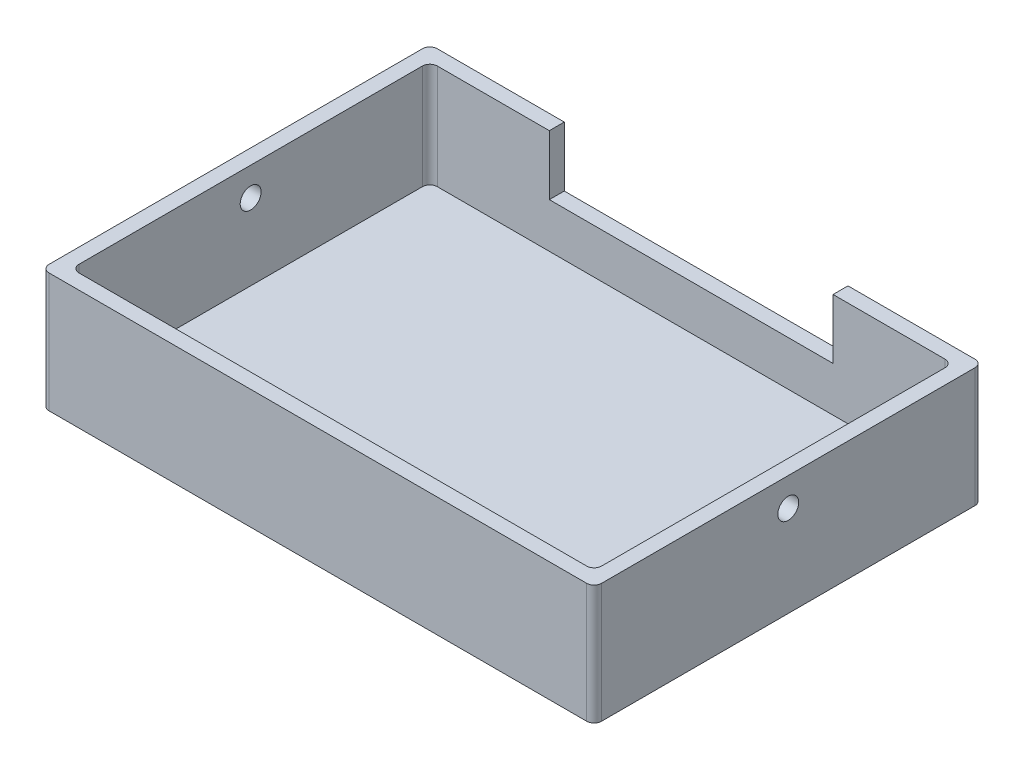
ISO-10303-21;
HEADER;
FILE_DESCRIPTION(('STEP AP214'),'2;1');
FILE_NAME('part.step','',(''),(''),'','','');
FILE_SCHEMA(('AUTOMOTIVE_DESIGN { 1 0 10303 214 1 1 1 1 }'));
ENDSEC;
DATA;
#1=APPLICATION_CONTEXT('core data for automotive mechanical design processes');
#2=APPLICATION_PROTOCOL_DEFINITION('international standard','automotive_design',2000,#1);
#3=PRODUCT_CONTEXT('',#1,'mechanical');
#4=PRODUCT('Part','Part','',(#3));
#5=PRODUCT_RELATED_PRODUCT_CATEGORY('part','',(#4));
#6=PRODUCT_DEFINITION_FORMATION('','',#4);
#7=PRODUCT_DEFINITION_CONTEXT('part definition',#1,'design');
#8=PRODUCT_DEFINITION('design','',#6,#7);
#9=PRODUCT_DEFINITION_SHAPE('','',#8);
#10=(LENGTH_UNIT() NAMED_UNIT(*) SI_UNIT(.MILLI.,.METRE.));
#11=(NAMED_UNIT(*) PLANE_ANGLE_UNIT() SI_UNIT($,.RADIAN.));
#12=(NAMED_UNIT(*) SI_UNIT($,.STERADIAN.) SOLID_ANGLE_UNIT());
#13=UNCERTAINTY_MEASURE_WITH_UNIT(LENGTH_MEASURE(1.E-05),#10,'distance_accuracy_value','');
#14=(GEOMETRIC_REPRESENTATION_CONTEXT(3) GLOBAL_UNCERTAINTY_ASSIGNED_CONTEXT((#13)) GLOBAL_UNIT_ASSIGNED_CONTEXT((#10,
#11,#12)) REPRESENTATION_CONTEXT('',''));
#15=CARTESIAN_POINT('',(0.,0.,0.));
#16=DIRECTION('',(0.,0.,1.));
#17=DIRECTION('',(1.,0.,0.));
#18=AXIS2_PLACEMENT_3D('',#15,#16,#17);
#19=CARTESIAN_POINT('',(-180.,10.,125.));
#20=DIRECTION('',(0.,-1.,0.));
#21=DIRECTION('',(0.,0.,-1.));
#22=AXIS2_PLACEMENT_3D('',#19,#20,#21);
#23=CYLINDRICAL_SURFACE('',#22,5.);
#24=CARTESIAN_POINT('',(-180.,0.,125.));
#25=DIRECTION('',(0.,1.,0.));
#26=DIRECTION('',(0.,0.,-1.));
#27=AXIS2_PLACEMENT_3D('',#24,#25,#26);
#28=CIRCLE('',#27,5.);
#29=CARTESIAN_POINT('',(-185.,0.,125.));
#30=VERTEX_POINT('',#29);
#31=CARTESIAN_POINT('',(-180.,0.,130.));
#32=VERTEX_POINT('',#31);
#33=EDGE_CURVE('E289',#30,#32,#28,.T.);
#34=ORIENTED_EDGE('',*,*,#33,.T.);
#35=DIRECTION('',(0.,-1.,0.));
#36=VECTOR('',#35,1.);
#37=CARTESIAN_POINT('',(-180.,10.,130.));
#38=LINE('',#37,#36);
#39=CARTESIAN_POINT('',(-180.,80.,130.));
#40=VERTEX_POINT('',#39);
#41=EDGE_CURVE('E327',#40,#32,#38,.T.);
#42=ORIENTED_EDGE('',*,*,#41,.F.);
#43=CARTESIAN_POINT('',(-180.,80.,125.));
#44=DIRECTION('',(0.,1.,0.));
#45=DIRECTION('',(0.,0.,-1.));
#46=AXIS2_PLACEMENT_3D('',#43,#44,#45);
#47=CIRCLE('',#46,5.);
#48=CARTESIAN_POINT('',(-185.,80.,125.));
#49=VERTEX_POINT('',#48);
#50=EDGE_CURVE('E277',#49,#40,#47,.T.);
#51=ORIENTED_EDGE('',*,*,#50,.F.);
#52=DIRECTION('',(0.,-1.,0.));
#53=VECTOR('',#52,1.);
#54=CARTESIAN_POINT('',(-185.,10.,125.));
#55=LINE('',#54,#53);
#56=EDGE_CURVE('E306',#49,#30,#55,.T.);
#57=ORIENTED_EDGE('',*,*,#56,.T.);
#58=EDGE_LOOP('',(#34,#42,#51,#57));
#59=FACE_BOUND('',#58,.T.);
#60=ADVANCED_FACE('F38',(#59),#23,.T.);
#61=CARTESIAN_POINT('',(-180.,10.,130.));
#62=DIRECTION('',(0.,0.,-1.));
#63=DIRECTION('',(-1.,0.,0.));
#64=AXIS2_PLACEMENT_3D('',#61,#62,#63);
#65=PLANE('',#64);
#66=DIRECTION('',(1.,0.,0.));
#67=VECTOR('',#66,1.);
#68=CARTESIAN_POINT('',(-180.,0.,130.));
#69=LINE('',#68,#67);
#70=CARTESIAN_POINT('',(180.,0.,130.));
#71=VERTEX_POINT('',#70);
#72=EDGE_CURVE('E292',#32,#71,#69,.T.);
#73=ORIENTED_EDGE('',*,*,#72,.T.);
#74=DIRECTION('',(0.,-1.,0.));
#75=VECTOR('',#74,1.);
#76=CARTESIAN_POINT('',(180.,10.,130.));
#77=LINE('',#76,#75);
#78=CARTESIAN_POINT('',(180.,80.,130.));
#79=VERTEX_POINT('',#78);
#80=EDGE_CURVE('E324',#79,#71,#77,.T.);
#81=ORIENTED_EDGE('',*,*,#80,.F.);
#82=DIRECTION('',(1.,0.,0.));
#83=VECTOR('',#82,1.);
#84=CARTESIAN_POINT('',(180.,80.,130.));
#85=LINE('',#84,#83);
#86=EDGE_CURVE('E280',#40,#79,#85,.T.);
#87=ORIENTED_EDGE('',*,*,#86,.F.);
#88=ORIENTED_EDGE('',*,*,#41,.T.);
#89=EDGE_LOOP('',(#73,#81,#87,#88));
#90=FACE_BOUND('',#89,.T.);
#91=ADVANCED_FACE('F363',(#90),#65,.F.);
#92=CARTESIAN_POINT('',(180.,10.,125.));
#93=DIRECTION('',(0.,-1.,0.));
#94=DIRECTION('',(0.,0.,-1.));
#95=AXIS2_PLACEMENT_3D('',#92,#93,#94);
#96=CYLINDRICAL_SURFACE('',#95,5.);
#97=CARTESIAN_POINT('',(180.,0.,125.));
#98=DIRECTION('',(0.,1.,0.));
#99=DIRECTION('',(0.,0.,1.));
#100=AXIS2_PLACEMENT_3D('',#97,#98,#99);
#101=CIRCLE('',#100,5.);
#102=CARTESIAN_POINT('',(185.,0.,125.));
#103=VERTEX_POINT('',#102);
#104=EDGE_CURVE('E294',#71,#103,#101,.T.);
#105=ORIENTED_EDGE('',*,*,#104,.T.);
#106=DIRECTION('',(0.,-1.,0.));
#107=VECTOR('',#106,1.);
#108=CARTESIAN_POINT('',(185.,10.,125.));
#109=LINE('',#108,#107);
#110=CARTESIAN_POINT('',(185.,80.,125.));
#111=VERTEX_POINT('',#110);
#112=EDGE_CURVE('E321',#111,#103,#109,.T.);
#113=ORIENTED_EDGE('',*,*,#112,.F.);
#114=CARTESIAN_POINT('',(180.,80.,125.));
#115=DIRECTION('',(0.,1.,0.));
#116=DIRECTION('',(0.,0.,-1.));
#117=AXIS2_PLACEMENT_3D('',#114,#115,#116);
#118=CIRCLE('',#117,5.);
#119=EDGE_CURVE('E283',#79,#111,#118,.T.);
#120=ORIENTED_EDGE('',*,*,#119,.F.);
#121=ORIENTED_EDGE('',*,*,#80,.T.);
#122=EDGE_LOOP('',(#105,#113,#120,#121));
#123=FACE_BOUND('',#122,.T.);
#124=ADVANCED_FACE('F367',(#123),#96,.T.);
#125=CARTESIAN_POINT('',(185.,10.,125.));
#126=DIRECTION('',(-1.,0.,0.));
#127=DIRECTION('',(0.,0.,1.));
#128=AXIS2_PLACEMENT_3D('',#125,#126,#127);
#129=PLANE('',#128);
#130=CARTESIAN_POINT('',(185.,61.,0.));
#131=DIRECTION('',(1.,0.,0.));
#132=DIRECTION('',(0.,0.,-1.));
#133=AXIS2_PLACEMENT_3D('',#130,#131,#132);
#134=CIRCLE('',#133,7.);
#135=CARTESIAN_POINT('',(185.,61.,-7.));
#136=VERTEX_POINT('',#135);
#137=EDGE_CURVE('E630',#136,#136,#134,.T.);
#138=ORIENTED_EDGE('',*,*,#137,.F.);
#139=EDGE_LOOP('',(#138));
#140=FACE_BOUND('',#139,.T.);
#141=DIRECTION('',(0.,0.,-1.));
#142=VECTOR('',#141,1.);
#143=CARTESIAN_POINT('',(185.,0.,125.));
#144=LINE('',#143,#142);
#145=CARTESIAN_POINT('',(185.,0.,-125.));
#146=VERTEX_POINT('',#145);
#147=EDGE_CURVE('E296',#103,#146,#144,.T.);
#148=ORIENTED_EDGE('',*,*,#147,.T.);
#149=DIRECTION('',(0.,-1.,0.));
#150=VECTOR('',#149,1.);
#151=CARTESIAN_POINT('',(185.,10.,-125.));
#152=LINE('',#151,#150);
#153=CARTESIAN_POINT('',(185.,80.,-125.));
#154=VERTEX_POINT('',#153);
#155=EDGE_CURVE('E318',#154,#146,#152,.T.);
#156=ORIENTED_EDGE('',*,*,#155,.F.);
#157=DIRECTION('',(0.,0.,-1.));
#158=VECTOR('',#157,1.);
#159=CARTESIAN_POINT('',(185.,80.,-125.));
#160=LINE('',#159,#158);
#161=EDGE_CURVE('E286',#111,#154,#160,.T.);
#162=ORIENTED_EDGE('',*,*,#161,.F.);
#163=ORIENTED_EDGE('',*,*,#112,.T.);
#164=EDGE_LOOP('',(#148,#156,#162,#163));
#165=FACE_BOUND('',#164,.T.);
#166=ADVANCED_FACE('F370',(#140,#165),#129,.F.);
#167=CARTESIAN_POINT('',(180.,10.,-125.));
#168=DIRECTION('',(0.,-1.,0.));
#169=DIRECTION('',(0.,0.,-1.));
#170=AXIS2_PLACEMENT_3D('',#167,#168,#169);
#171=CYLINDRICAL_SURFACE('',#170,5.);
#172=CARTESIAN_POINT('',(180.,0.,-125.));
#173=DIRECTION('',(0.,1.,0.));
#174=DIRECTION('',(0.,0.,-1.));
#175=AXIS2_PLACEMENT_3D('',#172,#173,#174);
#176=CIRCLE('',#175,5.);
#177=CARTESIAN_POINT('',(180.,0.,-130.));
#178=VERTEX_POINT('',#177);
#179=EDGE_CURVE('E298',#146,#178,#176,.T.);
#180=ORIENTED_EDGE('',*,*,#179,.T.);
#181=DIRECTION('',(0.,-1.,0.));
#182=VECTOR('',#181,1.);
#183=CARTESIAN_POINT('',(180.,10.,-130.));
#184=LINE('',#183,#182);
#185=CARTESIAN_POINT('',(180.,80.,-130.));
#186=VERTEX_POINT('',#185);
#187=EDGE_CURVE('E315',#186,#178,#184,.T.);
#188=ORIENTED_EDGE('',*,*,#187,.F.);
#189=CARTESIAN_POINT('',(180.,80.,-125.));
#190=DIRECTION('',(0.,1.,0.));
#191=DIRECTION('',(0.,0.,-1.));
#192=AXIS2_PLACEMENT_3D('',#189,#190,#191);
#193=CIRCLE('',#192,5.);
#194=EDGE_CURVE('E265',#154,#186,#193,.T.);
#195=ORIENTED_EDGE('',*,*,#194,.F.);
#196=ORIENTED_EDGE('',*,*,#155,.T.);
#197=EDGE_LOOP('',(#180,#188,#195,#196));
#198=FACE_BOUND('',#197,.T.);
#199=ADVANCED_FACE('F371',(#198),#171,.T.);
#200=CARTESIAN_POINT('',(-180.,10.,-130.));
#201=DIRECTION('',(0.,0.,1.));
#202=DIRECTION('',(1.,0.,0.));
#203=AXIS2_PLACEMENT_3D('',#200,#201,#202);
#204=PLANE('',#203);
#205=DIRECTION('',(-1.,0.,0.));
#206=VECTOR('',#205,1.);
#207=CARTESIAN_POINT('',(-95.,40.0000000000001,-130.));
#208=LINE('',#207,#206);
#209=CARTESIAN_POINT('',(95.,40.,-130.));
#210=VERTEX_POINT('',#209);
#211=CARTESIAN_POINT('',(-95.,40.0000000000001,-130.));
#212=VERTEX_POINT('',#211);
#213=EDGE_CURVE('E186',#210,#212,#208,.T.);
#214=ORIENTED_EDGE('',*,*,#213,.F.);
#215=DIRECTION('',(0.,-1.,0.));
#216=VECTOR('',#215,1.);
#217=CARTESIAN_POINT('',(95.,120.,-130.));
#218=LINE('',#217,#216);
#219=CARTESIAN_POINT('',(95.,80.,-130.));
#220=VERTEX_POINT('',#219);
#221=EDGE_CURVE('E175',#220,#210,#218,.T.);
#222=ORIENTED_EDGE('',*,*,#221,.F.);
#223=DIRECTION('',(-1.,0.,0.));
#224=VECTOR('',#223,1.);
#225=CARTESIAN_POINT('',(180.,80.,-130.));
#226=LINE('',#225,#224);
#227=EDGE_CURVE('E269',#186,#220,#226,.T.);
#228=ORIENTED_EDGE('',*,*,#227,.F.);
#229=ORIENTED_EDGE('',*,*,#187,.T.);
#230=DIRECTION('',(-1.,0.,0.));
#231=VECTOR('',#230,1.);
#232=CARTESIAN_POINT('',(-180.,0.,-130.));
#233=LINE('',#232,#231);
#234=CARTESIAN_POINT('',(-180.,0.,-130.));
#235=VERTEX_POINT('',#234);
#236=EDGE_CURVE('E300',#178,#235,#233,.T.);
#237=ORIENTED_EDGE('',*,*,#236,.T.);
#238=DIRECTION('',(0.,-1.,0.));
#239=VECTOR('',#238,1.);
#240=CARTESIAN_POINT('',(-180.,10.,-130.));
#241=LINE('',#240,#239);
#242=CARTESIAN_POINT('',(-180.,80.,-130.));
#243=VERTEX_POINT('',#242);
#244=EDGE_CURVE('E312',#243,#235,#241,.T.);
#245=ORIENTED_EDGE('',*,*,#244,.F.);
#246=CARTESIAN_POINT('',(-95.,80.,-130.));
#247=VERTEX_POINT('',#246);
#248=EDGE_CURVE('E268',#247,#243,#226,.T.);
#249=ORIENTED_EDGE('',*,*,#248,.F.);
#250=DIRECTION('',(0.,1.,0.));
#251=VECTOR('',#250,1.);
#252=CARTESIAN_POINT('',(-95.,120.,-130.));
#253=LINE('',#252,#251);
#254=EDGE_CURVE('E193',#212,#247,#253,.T.);
#255=ORIENTED_EDGE('',*,*,#254,.F.);
#256=EDGE_LOOP('',(#214,#222,#228,#229,#237,#245,#249,#255));
#257=FACE_BOUND('',#256,.T.);
#258=ADVANCED_FACE('F195',(#257),#204,.F.);
#259=CARTESIAN_POINT('',(-180.,10.,-125.));
#260=DIRECTION('',(0.,-1.,0.));
#261=DIRECTION('',(0.,0.,-1.));
#262=AXIS2_PLACEMENT_3D('',#259,#260,#261);
#263=CYLINDRICAL_SURFACE('',#262,5.);
#264=CARTESIAN_POINT('',(-180.,0.,-125.));
#265=DIRECTION('',(0.,1.,0.));
#266=DIRECTION('',(0.,0.,-1.));
#267=AXIS2_PLACEMENT_3D('',#264,#265,#266);
#268=CIRCLE('',#267,5.);
#269=CARTESIAN_POINT('',(-185.,0.,-125.));
#270=VERTEX_POINT('',#269);
#271=EDGE_CURVE('E302',#235,#270,#268,.T.);
#272=ORIENTED_EDGE('',*,*,#271,.T.);
#273=DIRECTION('',(0.,-1.,0.));
#274=VECTOR('',#273,1.);
#275=CARTESIAN_POINT('',(-185.,10.,-125.));
#276=LINE('',#275,#274);
#277=CARTESIAN_POINT('',(-185.,80.,-125.));
#278=VERTEX_POINT('',#277);
#279=EDGE_CURVE('E309',#278,#270,#276,.T.);
#280=ORIENTED_EDGE('',*,*,#279,.F.);
#281=CARTESIAN_POINT('',(-180.,80.,-125.));
#282=DIRECTION('',(0.,1.,0.));
#283=DIRECTION('',(0.,0.,1.));
#284=AXIS2_PLACEMENT_3D('',#281,#282,#283);
#285=CIRCLE('',#284,5.);
#286=EDGE_CURVE('E271',#243,#278,#285,.T.);
#287=ORIENTED_EDGE('',*,*,#286,.F.);
#288=ORIENTED_EDGE('',*,*,#244,.T.);
#289=EDGE_LOOP('',(#272,#280,#287,#288));
#290=FACE_BOUND('',#289,.T.);
#291=ADVANCED_FACE('F354',(#290),#263,.T.);
#292=CARTESIAN_POINT('',(-185.,10.,125.));
#293=DIRECTION('',(1.,0.,0.));
#294=DIRECTION('',(0.,0.,-1.));
#295=AXIS2_PLACEMENT_3D('',#292,#293,#294);
#296=PLANE('',#295);
#297=CARTESIAN_POINT('',(-185.,61.,0.));
#298=DIRECTION('',(1.,0.,0.));
#299=DIRECTION('',(0.,0.,-1.));
#300=AXIS2_PLACEMENT_3D('',#297,#298,#299);
#301=CIRCLE('',#300,7.);
#302=CARTESIAN_POINT('',(-185.,61.,-7.));
#303=VERTEX_POINT('',#302);
#304=EDGE_CURVE('E629',#303,#303,#301,.T.);
#305=ORIENTED_EDGE('',*,*,#304,.T.);
#306=EDGE_LOOP('',(#305));
#307=FACE_BOUND('',#306,.T.);
#308=DIRECTION('',(0.,0.,1.));
#309=VECTOR('',#308,1.);
#310=CARTESIAN_POINT('',(-185.,0.,125.));
#311=LINE('',#310,#309);
#312=EDGE_CURVE('E304',#270,#30,#311,.T.);
#313=ORIENTED_EDGE('',*,*,#312,.T.);
#314=ORIENTED_EDGE('',*,*,#56,.F.);
#315=DIRECTION('',(0.,0.,1.));
#316=VECTOR('',#315,1.);
#317=CARTESIAN_POINT('',(-185.,80.,-125.));
#318=LINE('',#317,#316);
#319=EDGE_CURVE('E274',#278,#49,#318,.T.);
#320=ORIENTED_EDGE('',*,*,#319,.F.);
#321=ORIENTED_EDGE('',*,*,#279,.T.);
#322=EDGE_LOOP('',(#313,#314,#320,#321));
#323=FACE_BOUND('',#322,.T.);
#324=ADVANCED_FACE('F358',(#307,#323),#296,.F.);
#325=CARTESIAN_POINT('',(-180.,0.,125.));
#326=DIRECTION('',(0.,-1.,0.));
#327=DIRECTION('',(0.,0.,-1.));
#328=AXIS2_PLACEMENT_3D('',#325,#326,#327);
#329=PLANE('',#328);
#330=ORIENTED_EDGE('',*,*,#33,.F.);
#331=ORIENTED_EDGE('',*,*,#312,.F.);
#332=ORIENTED_EDGE('',*,*,#271,.F.);
#333=ORIENTED_EDGE('',*,*,#236,.F.);
#334=ORIENTED_EDGE('',*,*,#179,.F.);
#335=ORIENTED_EDGE('',*,*,#147,.F.);
#336=ORIENTED_EDGE('',*,*,#104,.F.);
#337=ORIENTED_EDGE('',*,*,#72,.F.);
#338=EDGE_LOOP('',(#330,#331,#332,#333,#334,#335,#336,#337));
#339=FACE_BOUND('',#338,.T.);
#340=ADVANCED_FACE('F350',(#339),#329,.T.);
#341=CARTESIAN_POINT('',(180.,80.,-125.));
#342=DIRECTION('',(0.,-1.,0.));
#343=DIRECTION('',(0.,0.,-1.));
#344=AXIS2_PLACEMENT_3D('',#341,#342,#343);
#345=PLANE('',#344);
#346=ORIENTED_EDGE('',*,*,#227,.T.);
#347=DIRECTION('',(0.,0.,1.));
#348=VECTOR('',#347,1.);
#349=CARTESIAN_POINT('',(95.,80.,-125.));
#350=LINE('',#349,#348);
#351=CARTESIAN_POINT('',(95.,80.,-120.));
#352=VERTEX_POINT('',#351);
#353=EDGE_CURVE('E181',#220,#352,#350,.T.);
#354=ORIENTED_EDGE('',*,*,#353,.T.);
#355=DIRECTION('',(-1.,0.,0.));
#356=VECTOR('',#355,1.);
#357=CARTESIAN_POINT('',(170.,80.,-120.));
#358=LINE('',#357,#356);
#359=CARTESIAN_POINT('',(170.,80.,-120.));
#360=VERTEX_POINT('',#359);
#361=EDGE_CURVE('E211',#360,#352,#358,.T.);
#362=ORIENTED_EDGE('',*,*,#361,.F.);
#363=CARTESIAN_POINT('',(170.,80.,-115.));
#364=DIRECTION('',(0.,1.,0.));
#365=DIRECTION('',(0.,0.,-1.));
#366=AXIS2_PLACEMENT_3D('',#363,#364,#365);
#367=CIRCLE('',#366,5.);
#368=CARTESIAN_POINT('',(175.,80.,-115.));
#369=VERTEX_POINT('',#368);
#370=EDGE_CURVE('E207',#369,#360,#367,.T.);
#371=ORIENTED_EDGE('',*,*,#370,.F.);
#372=DIRECTION('',(0.,0.,-1.));
#373=VECTOR('',#372,1.);
#374=CARTESIAN_POINT('',(175.,80.,-115.));
#375=LINE('',#374,#373);
#376=CARTESIAN_POINT('',(175.,80.,115.));
#377=VERTEX_POINT('',#376);
#378=EDGE_CURVE('E225',#377,#369,#375,.T.);
#379=ORIENTED_EDGE('',*,*,#378,.F.);
#380=CARTESIAN_POINT('',(170.,80.,115.));
#381=DIRECTION('',(0.,1.,0.));
#382=DIRECTION('',(0.,0.,-1.));
#383=AXIS2_PLACEMENT_3D('',#380,#381,#382);
#384=CIRCLE('',#383,5.);
#385=CARTESIAN_POINT('',(170.,80.,120.));
#386=VERTEX_POINT('',#385);
#387=EDGE_CURVE('E222',#386,#377,#384,.T.);
#388=ORIENTED_EDGE('',*,*,#387,.F.);
#389=DIRECTION('',(1.,0.,0.));
#390=VECTOR('',#389,1.);
#391=CARTESIAN_POINT('',(170.,80.,120.));
#392=LINE('',#391,#390);
#393=CARTESIAN_POINT('',(-170.,80.,120.));
#394=VERTEX_POINT('',#393);
#395=EDGE_CURVE('E220',#394,#386,#392,.T.);
#396=ORIENTED_EDGE('',*,*,#395,.F.);
#397=CARTESIAN_POINT('',(-170.,80.,115.));
#398=DIRECTION('',(0.,1.,0.));
#399=DIRECTION('',(0.,0.,-1.));
#400=AXIS2_PLACEMENT_3D('',#397,#398,#399);
#401=CIRCLE('',#400,5.);
#402=CARTESIAN_POINT('',(-175.,80.,115.));
#403=VERTEX_POINT('',#402);
#404=EDGE_CURVE('E218',#403,#394,#401,.T.);
#405=ORIENTED_EDGE('',*,*,#404,.F.);
#406=DIRECTION('',(0.,0.,1.));
#407=VECTOR('',#406,1.);
#408=CARTESIAN_POINT('',(-175.,80.,-115.));
#409=LINE('',#408,#407);
#410=CARTESIAN_POINT('',(-175.,80.,-115.));
#411=VERTEX_POINT('',#410);
#412=EDGE_CURVE('E216',#411,#403,#409,.T.);
#413=ORIENTED_EDGE('',*,*,#412,.F.);
#414=CARTESIAN_POINT('',(-170.,80.,-115.));
#415=DIRECTION('',(0.,1.,0.));
#416=DIRECTION('',(0.,0.,1.));
#417=AXIS2_PLACEMENT_3D('',#414,#415,#416);
#418=CIRCLE('',#417,5.);
#419=CARTESIAN_POINT('',(-170.,80.,-120.));
#420=VERTEX_POINT('',#419);
#421=EDGE_CURVE('E214',#420,#411,#418,.T.);
#422=ORIENTED_EDGE('',*,*,#421,.F.);
#423=CARTESIAN_POINT('',(-95.,80.,-120.));
#424=VERTEX_POINT('',#423);
#425=EDGE_CURVE('E209',#424,#420,#358,.T.);
#426=ORIENTED_EDGE('',*,*,#425,.F.);
#427=DIRECTION('',(0.,0.,-1.));
#428=VECTOR('',#427,1.);
#429=CARTESIAN_POINT('',(-95.,80.,-125.));
#430=LINE('',#429,#428);
#431=EDGE_CURVE('E201',#424,#247,#430,.T.);
#432=ORIENTED_EDGE('',*,*,#431,.T.);
#433=ORIENTED_EDGE('',*,*,#248,.T.);
#434=ORIENTED_EDGE('',*,*,#286,.T.);
#435=ORIENTED_EDGE('',*,*,#319,.T.);
#436=ORIENTED_EDGE('',*,*,#50,.T.);
#437=ORIENTED_EDGE('',*,*,#86,.T.);
#438=ORIENTED_EDGE('',*,*,#119,.T.);
#439=ORIENTED_EDGE('',*,*,#161,.T.);
#440=ORIENTED_EDGE('',*,*,#194,.T.);
#441=EDGE_LOOP('',(#346,#354,#362,#371,#379,#388,#396,#405,#413,#422,#426,#432,#433,#434,#435,
#436,#437,#438,#439,#440));
#442=FACE_BOUND('',#441,.T.);
#443=ADVANCED_FACE('F340',(#442),#345,.F.);
#444=CARTESIAN_POINT('',(170.,80.,-115.));
#445=DIRECTION('',(0.,-1.,0.));
#446=DIRECTION('',(0.,0.,-1.));
#447=AXIS2_PLACEMENT_3D('',#444,#445,#446);
#448=CYLINDRICAL_SURFACE('',#447,5.);
#449=CARTESIAN_POINT('',(170.,10.,-115.));
#450=DIRECTION('',(0.,1.,0.));
#451=DIRECTION('',(0.,0.,-1.));
#452=AXIS2_PLACEMENT_3D('',#449,#450,#451);
#453=CIRCLE('',#452,5.);
#454=CARTESIAN_POINT('',(175.,10.,-115.));
#455=VERTEX_POINT('',#454);
#456=CARTESIAN_POINT('',(170.,10.,-120.));
#457=VERTEX_POINT('',#456);
#458=EDGE_CURVE('E206',#455,#457,#453,.T.);
#459=ORIENTED_EDGE('',*,*,#458,.F.);
#460=DIRECTION('',(0.,-1.,0.));
#461=VECTOR('',#460,1.);
#462=CARTESIAN_POINT('',(175.,80.,-115.));
#463=LINE('',#462,#461);
#464=EDGE_CURVE('E61',#369,#455,#463,.T.);
#465=ORIENTED_EDGE('',*,*,#464,.F.);
#466=ORIENTED_EDGE('',*,*,#370,.T.);
#467=DIRECTION('',(0.,-1.,0.));
#468=VECTOR('',#467,1.);
#469=CARTESIAN_POINT('',(170.,80.,-120.));
#470=LINE('',#469,#468);
#471=EDGE_CURVE('E262',#360,#457,#470,.T.);
#472=ORIENTED_EDGE('',*,*,#471,.T.);
#473=EDGE_LOOP('',(#459,#465,#466,#472));
#474=FACE_BOUND('',#473,.T.);
#475=ADVANCED_FACE('F491',(#474),#448,.F.);
#476=CARTESIAN_POINT('',(170.,80.,-120.));
#477=DIRECTION('',(0.,0.,1.));
#478=DIRECTION('',(1.,0.,0.));
#479=AXIS2_PLACEMENT_3D('',#476,#477,#478);
#480=PLANE('',#479);
#481=DIRECTION('',(0.,1.,0.));
#482=VECTOR('',#481,1.);
#483=CARTESIAN_POINT('',(95.,80.,-120.));
#484=LINE('',#483,#482);
#485=CARTESIAN_POINT('',(95.,40.,-120.));
#486=VERTEX_POINT('',#485);
#487=EDGE_CURVE('E11',#486,#352,#484,.T.);
#488=ORIENTED_EDGE('',*,*,#487,.F.);
#489=DIRECTION('',(1.,0.,0.));
#490=VECTOR('',#489,1.);
#491=CARTESIAN_POINT('',(170.,40.,-120.));
#492=LINE('',#491,#490);
#493=CARTESIAN_POINT('',(-95.,40.0000000000001,-120.));
#494=VERTEX_POINT('',#493);
#495=EDGE_CURVE('E192',#494,#486,#492,.T.);
#496=ORIENTED_EDGE('',*,*,#495,.F.);
#497=DIRECTION('',(0.,-1.,0.));
#498=VECTOR('',#497,1.);
#499=CARTESIAN_POINT('',(-95.,80.,-120.));
#500=LINE('',#499,#498);
#501=EDGE_CURVE('E46',#424,#494,#500,.T.);
#502=ORIENTED_EDGE('',*,*,#501,.F.);
#503=ORIENTED_EDGE('',*,*,#425,.T.);
#504=DIRECTION('',(0.,-1.,0.));
#505=VECTOR('',#504,1.);
#506=CARTESIAN_POINT('',(-170.,80.,-120.));
#507=LINE('',#506,#505);
#508=CARTESIAN_POINT('',(-170.,10.,-120.));
#509=VERTEX_POINT('',#508);
#510=EDGE_CURVE('E260',#420,#509,#507,.T.);
#511=ORIENTED_EDGE('',*,*,#510,.T.);
#512=DIRECTION('',(-1.,0.,0.));
#513=VECTOR('',#512,1.);
#514=CARTESIAN_POINT('',(170.,10.,-120.));
#515=LINE('',#514,#513);
#516=EDGE_CURVE('E229',#457,#509,#515,.T.);
#517=ORIENTED_EDGE('',*,*,#516,.F.);
#518=ORIENTED_EDGE('',*,*,#471,.F.);
#519=ORIENTED_EDGE('',*,*,#361,.T.);
#520=EDGE_LOOP('',(#488,#496,#502,#503,#511,#517,#518,#519));
#521=FACE_BOUND('',#520,.T.);
#522=ADVANCED_FACE('F336',(#521),#480,.T.);
#523=CARTESIAN_POINT('',(-170.,80.,-115.));
#524=DIRECTION('',(0.,-1.,0.));
#525=DIRECTION('',(0.,0.,-1.));
#526=AXIS2_PLACEMENT_3D('',#523,#524,#525);
#527=CYLINDRICAL_SURFACE('',#526,5.);
#528=CARTESIAN_POINT('',(-170.,10.,-115.));
#529=DIRECTION('',(0.,1.,0.));
#530=DIRECTION('',(0.,0.,1.));
#531=AXIS2_PLACEMENT_3D('',#528,#529,#530);
#532=CIRCLE('',#531,5.);
#533=CARTESIAN_POINT('',(-175.,10.,-115.));
#534=VERTEX_POINT('',#533);
#535=EDGE_CURVE('E232',#509,#534,#532,.T.);
#536=ORIENTED_EDGE('',*,*,#535,.F.);
#537=ORIENTED_EDGE('',*,*,#510,.F.);
#538=ORIENTED_EDGE('',*,*,#421,.T.);
#539=DIRECTION('',(0.,-1.,0.));
#540=VECTOR('',#539,1.);
#541=CARTESIAN_POINT('',(-175.,80.,-115.));
#542=LINE('',#541,#540);
#543=EDGE_CURVE('E258',#411,#534,#542,.T.);
#544=ORIENTED_EDGE('',*,*,#543,.T.);
#545=EDGE_LOOP('',(#536,#537,#538,#544));
#546=FACE_BOUND('',#545,.T.);
#547=ADVANCED_FACE('F427',(#546),#527,.F.);
#548=CARTESIAN_POINT('',(-175.,80.,-115.));
#549=DIRECTION('',(1.,0.,0.));
#550=DIRECTION('',(0.,0.,-1.));
#551=AXIS2_PLACEMENT_3D('',#548,#549,#550);
#552=PLANE('',#551);
#553=CARTESIAN_POINT('',(-175.,61.,0.));
#554=DIRECTION('',(1.,0.,0.));
#555=DIRECTION('',(0.,0.,-1.));
#556=AXIS2_PLACEMENT_3D('',#553,#554,#555);
#557=CIRCLE('',#556,7.);
#558=CARTESIAN_POINT('',(-175.,61.,-7.));
#559=VERTEX_POINT('',#558);
#560=EDGE_CURVE('E187',#559,#559,#557,.T.);
#561=ORIENTED_EDGE('',*,*,#560,.F.);
#562=EDGE_LOOP('',(#561));
#563=FACE_BOUND('',#562,.T.);
#564=DIRECTION('',(0.,0.,1.));
#565=VECTOR('',#564,1.);
#566=CARTESIAN_POINT('',(-175.,10.,-115.));
#567=LINE('',#566,#565);
#568=CARTESIAN_POINT('',(-175.,10.,115.));
#569=VERTEX_POINT('',#568);
#570=EDGE_CURVE('E235',#534,#569,#567,.T.);
#571=ORIENTED_EDGE('',*,*,#570,.F.);
#572=ORIENTED_EDGE('',*,*,#543,.F.);
#573=ORIENTED_EDGE('',*,*,#412,.T.);
#574=DIRECTION('',(0.,-1.,0.));
#575=VECTOR('',#574,1.);
#576=CARTESIAN_POINT('',(-175.,80.,115.));
#577=LINE('',#576,#575);
#578=EDGE_CURVE('E256',#403,#569,#577,.T.);
#579=ORIENTED_EDGE('',*,*,#578,.T.);
#580=EDGE_LOOP('',(#571,#572,#573,#579));
#581=FACE_BOUND('',#580,.T.);
#582=ADVANCED_FACE('F421',(#563,#581),#552,.T.);
#583=CARTESIAN_POINT('',(-170.,80.,115.));
#584=DIRECTION('',(0.,-1.,0.));
#585=DIRECTION('',(0.,0.,-1.));
#586=AXIS2_PLACEMENT_3D('',#583,#584,#585);
#587=CYLINDRICAL_SURFACE('',#586,5.);
#588=CARTESIAN_POINT('',(-170.,10.,115.));
#589=DIRECTION('',(0.,1.,0.));
#590=DIRECTION('',(0.,0.,-1.));
#591=AXIS2_PLACEMENT_3D('',#588,#589,#590);
#592=CIRCLE('',#591,5.);
#593=CARTESIAN_POINT('',(-170.,10.,120.));
#594=VERTEX_POINT('',#593);
#595=EDGE_CURVE('E238',#569,#594,#592,.T.);
#596=ORIENTED_EDGE('',*,*,#595,.F.);
#597=ORIENTED_EDGE('',*,*,#578,.F.);
#598=ORIENTED_EDGE('',*,*,#404,.T.);
#599=DIRECTION('',(0.,-1.,0.));
#600=VECTOR('',#599,1.);
#601=CARTESIAN_POINT('',(-170.,80.,120.));
#602=LINE('',#601,#600);
#603=EDGE_CURVE('E254',#394,#594,#602,.T.);
#604=ORIENTED_EDGE('',*,*,#603,.T.);
#605=EDGE_LOOP('',(#596,#597,#598,#604));
#606=FACE_BOUND('',#605,.T.);
#607=ADVANCED_FACE('F426',(#606),#587,.F.);
#608=CARTESIAN_POINT('',(170.,80.,120.));
#609=DIRECTION('',(0.,0.,-1.));
#610=DIRECTION('',(-1.,0.,0.));
#611=AXIS2_PLACEMENT_3D('',#608,#609,#610);
#612=PLANE('',#611);
#613=DIRECTION('',(1.,0.,0.));
#614=VECTOR('',#613,1.);
#615=CARTESIAN_POINT('',(170.,10.,120.));
#616=LINE('',#615,#614);
#617=CARTESIAN_POINT('',(170.,10.,120.));
#618=VERTEX_POINT('',#617);
#619=EDGE_CURVE('E241',#594,#618,#616,.T.);
#620=ORIENTED_EDGE('',*,*,#619,.F.);
#621=ORIENTED_EDGE('',*,*,#603,.F.);
#622=ORIENTED_EDGE('',*,*,#395,.T.);
#623=DIRECTION('',(0.,-1.,0.));
#624=VECTOR('',#623,1.);
#625=CARTESIAN_POINT('',(170.,80.,120.));
#626=LINE('',#625,#624);
#627=EDGE_CURVE('E252',#386,#618,#626,.T.);
#628=ORIENTED_EDGE('',*,*,#627,.T.);
#629=EDGE_LOOP('',(#620,#621,#622,#628));
#630=FACE_BOUND('',#629,.T.);
#631=ADVANCED_FACE('F480',(#630),#612,.T.);
#632=CARTESIAN_POINT('',(170.,80.,115.));
#633=DIRECTION('',(0.,-1.,0.));
#634=DIRECTION('',(0.,0.,-1.));
#635=AXIS2_PLACEMENT_3D('',#632,#633,#634);
#636=CYLINDRICAL_SURFACE('',#635,5.);
#637=CARTESIAN_POINT('',(170.,10.,115.));
#638=DIRECTION('',(0.,1.,0.));
#639=DIRECTION('',(0.,0.,-1.));
#640=AXIS2_PLACEMENT_3D('',#637,#638,#639);
#641=CIRCLE('',#640,5.);
#642=CARTESIAN_POINT('',(175.,10.,115.));
#643=VERTEX_POINT('',#642);
#644=EDGE_CURVE('E244',#618,#643,#641,.T.);
#645=ORIENTED_EDGE('',*,*,#644,.F.);
#646=ORIENTED_EDGE('',*,*,#627,.F.);
#647=ORIENTED_EDGE('',*,*,#387,.T.);
#648=DIRECTION('',(0.,-1.,0.));
#649=VECTOR('',#648,1.);
#650=CARTESIAN_POINT('',(175.,80.,115.));
#651=LINE('',#650,#649);
#652=EDGE_CURVE('E250',#377,#643,#651,.T.);
#653=ORIENTED_EDGE('',*,*,#652,.T.);
#654=EDGE_LOOP('',(#645,#646,#647,#653));
#655=FACE_BOUND('',#654,.T.);
#656=ADVANCED_FACE('F443',(#655),#636,.F.);
#657=CARTESIAN_POINT('',(175.,80.,-115.));
#658=DIRECTION('',(-1.,0.,0.));
#659=DIRECTION('',(0.,0.,1.));
#660=AXIS2_PLACEMENT_3D('',#657,#658,#659);
#661=PLANE('',#660);
#662=CARTESIAN_POINT('',(175.,61.,0.));
#663=DIRECTION('',(-1.,0.,0.));
#664=DIRECTION('',(0.,0.,1.));
#665=AXIS2_PLACEMENT_3D('',#662,#663,#664);
#666=CIRCLE('',#665,7.);
#667=CARTESIAN_POINT('',(175.,61.,7.));
#668=VERTEX_POINT('',#667);
#669=EDGE_CURVE('E41',#668,#668,#666,.T.);
#670=ORIENTED_EDGE('',*,*,#669,.F.);
#671=EDGE_LOOP('',(#670));
#672=FACE_BOUND('',#671,.T.);
#673=DIRECTION('',(0.,0.,-1.));
#674=VECTOR('',#673,1.);
#675=CARTESIAN_POINT('',(175.,10.,-115.));
#676=LINE('',#675,#674);
#677=EDGE_CURVE('E210',#643,#455,#676,.T.);
#678=ORIENTED_EDGE('',*,*,#677,.F.);
#679=ORIENTED_EDGE('',*,*,#652,.F.);
#680=ORIENTED_EDGE('',*,*,#378,.T.);
#681=ORIENTED_EDGE('',*,*,#464,.T.);
#682=EDGE_LOOP('',(#678,#679,#680,#681));
#683=FACE_BOUND('',#682,.T.);
#684=ADVANCED_FACE('F437',(#672,#683),#661,.T.);
#685=CARTESIAN_POINT('',(-180.,10.,125.));
#686=DIRECTION('',(0.,-1.,0.));
#687=DIRECTION('',(0.,0.,-1.));
#688=AXIS2_PLACEMENT_3D('',#685,#686,#687);
#689=PLANE('',#688);
#690=ORIENTED_EDGE('',*,*,#677,.T.);
#691=ORIENTED_EDGE('',*,*,#458,.T.);
#692=ORIENTED_EDGE('',*,*,#516,.T.);
#693=ORIENTED_EDGE('',*,*,#535,.T.);
#694=ORIENTED_EDGE('',*,*,#570,.T.);
#695=ORIENTED_EDGE('',*,*,#595,.T.);
#696=ORIENTED_EDGE('',*,*,#619,.T.);
#697=ORIENTED_EDGE('',*,*,#644,.T.);
#698=EDGE_LOOP('',(#690,#691,#692,#693,#694,#695,#696,#697));
#699=FACE_BOUND('',#698,.T.);
#700=ADVANCED_FACE('F442',(#699),#689,.F.);
#701=CARTESIAN_POINT('',(95.,120.,-60.));
#702=DIRECTION('',(1.,0.,0.));
#703=DIRECTION('',(0.,1.,0.));
#704=AXIS2_PLACEMENT_3D('',#701,#702,#703);
#705=PLANE('',#704);
#706=ORIENTED_EDGE('',*,*,#221,.T.);
#707=DIRECTION('',(0.,0.,-1.));
#708=VECTOR('',#707,1.);
#709=CARTESIAN_POINT('',(95.,40.,-60.));
#710=LINE('',#709,#708);
#711=EDGE_CURVE('E178',#486,#210,#710,.T.);
#712=ORIENTED_EDGE('',*,*,#711,.F.);
#713=ORIENTED_EDGE('',*,*,#487,.T.);
#714=ORIENTED_EDGE('',*,*,#353,.F.);
#715=EDGE_LOOP('',(#706,#712,#713,#714));
#716=FACE_BOUND('',#715,.T.);
#717=ADVANCED_FACE('F177',(#716),#705,.F.);
#718=CARTESIAN_POINT('',(-95.,120.,-60.));
#719=DIRECTION('',(-1.,0.,0.));
#720=DIRECTION('',(0.,-1.,0.));
#721=AXIS2_PLACEMENT_3D('',#718,#719,#720);
#722=PLANE('',#721);
#723=ORIENTED_EDGE('',*,*,#501,.T.);
#724=DIRECTION('',(0.,0.,-1.));
#725=VECTOR('',#724,1.);
#726=CARTESIAN_POINT('',(-95.,40.0000000000001,-60.));
#727=LINE('',#726,#725);
#728=EDGE_CURVE('E53',#494,#212,#727,.T.);
#729=ORIENTED_EDGE('',*,*,#728,.T.);
#730=ORIENTED_EDGE('',*,*,#254,.T.);
#731=ORIENTED_EDGE('',*,*,#431,.F.);
#732=EDGE_LOOP('',(#723,#729,#730,#731));
#733=FACE_BOUND('',#732,.T.);
#734=ADVANCED_FACE('F333',(#733),#722,.F.);
#735=CARTESIAN_POINT('',(-95.,40.0000000000001,-60.));
#736=DIRECTION('',(0.,-1.,0.));
#737=DIRECTION('',(1.,0.,0.));
#738=AXIS2_PLACEMENT_3D('',#735,#736,#737);
#739=PLANE('',#738);
#740=ORIENTED_EDGE('',*,*,#495,.T.);
#741=ORIENTED_EDGE('',*,*,#711,.T.);
#742=ORIENTED_EDGE('',*,*,#213,.T.);
#743=ORIENTED_EDGE('',*,*,#728,.F.);
#744=EDGE_LOOP('',(#740,#741,#742,#743));
#745=FACE_BOUND('',#744,.T.);
#746=ADVANCED_FACE('F189',(#745),#739,.F.);
#747=CARTESIAN_POINT('',(-185.,61.,0.));
#748=DIRECTION('',(1.,0.,0.));
#749=DIRECTION('',(0.,0.,-1.));
#750=AXIS2_PLACEMENT_3D('',#747,#748,#749);
#751=CYLINDRICAL_SURFACE('',#750,7.);
#752=ORIENTED_EDGE('',*,*,#669,.T.);
#753=EDGE_LOOP('',(#752));
#754=FACE_BOUND('',#753,.T.);
#755=ORIENTED_EDGE('',*,*,#137,.T.);
#756=EDGE_LOOP('',(#755));
#757=FACE_BOUND('',#756,.T.);
#758=ADVANCED_FACE('F453',(#754,#757),#751,.F.);
#759=ORIENTED_EDGE('',*,*,#560,.T.);
#760=EDGE_LOOP('',(#759));
#761=FACE_BOUND('',#760,.T.);
#762=ORIENTED_EDGE('',*,*,#304,.F.);
#763=EDGE_LOOP('',(#762));
#764=FACE_BOUND('',#763,.T.);
#765=ADVANCED_FACE('F458',(#761,#764),#751,.F.);
#766=CLOSED_SHELL('',(#60,#91,#124,#166,#199,#258,#291,#324,#340,#443,#475,#522,#547,#582,#607,
#631,#656,#684,#700,#717,#734,#746,#758,#765));
#767=MANIFOLD_SOLID_BREP('B2',#766);
#768=ADVANCED_BREP_SHAPE_REPRESENTATION('',(#18,#767),#14);
#769=SHAPE_DEFINITION_REPRESENTATION(#9,#768);
ENDSEC;
END-ISO-10303-21;
